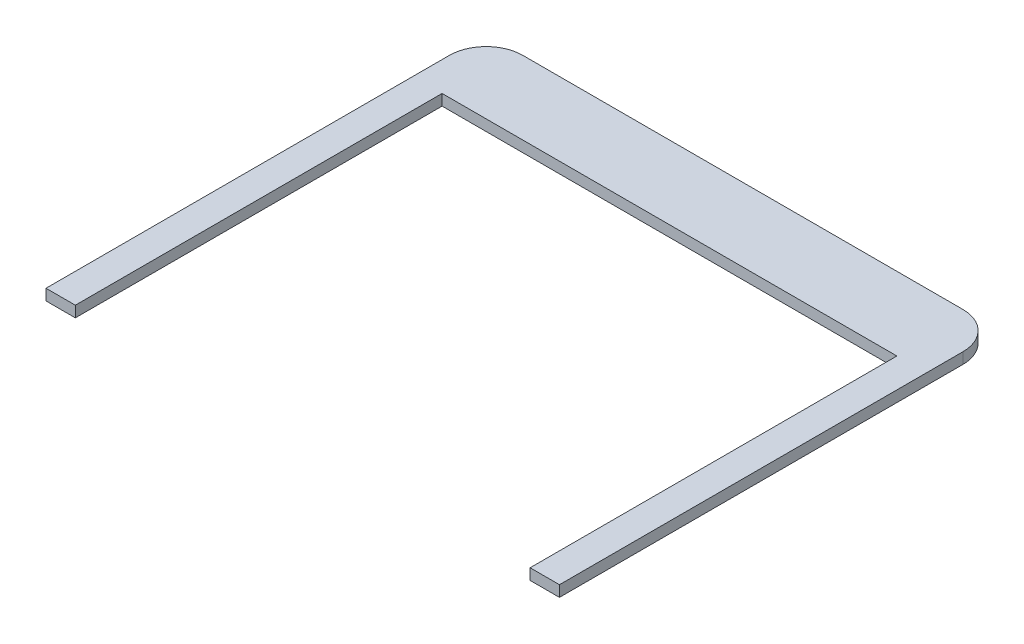
ISO-10303-21;
HEADER;
FILE_DESCRIPTION(('STEP AP214'),'2;1');
FILE_NAME('part.step','',(''),(''),'','','');
FILE_SCHEMA(('AUTOMOTIVE_DESIGN { 1 0 10303 214 1 1 1 1 }'));
ENDSEC;
DATA;
#1=APPLICATION_CONTEXT('core data for automotive mechanical design processes');
#2=APPLICATION_PROTOCOL_DEFINITION('international standard','automotive_design',2000,#1);
#3=PRODUCT_CONTEXT('',#1,'mechanical');
#4=PRODUCT('Part','Part','',(#3));
#5=PRODUCT_RELATED_PRODUCT_CATEGORY('part','',(#4));
#6=PRODUCT_DEFINITION_FORMATION('','',#4);
#7=PRODUCT_DEFINITION_CONTEXT('part definition',#1,'design');
#8=PRODUCT_DEFINITION('design','',#6,#7);
#9=PRODUCT_DEFINITION_SHAPE('','',#8);
#10=(LENGTH_UNIT() NAMED_UNIT(*) SI_UNIT(.MILLI.,.METRE.));
#11=(NAMED_UNIT(*) PLANE_ANGLE_UNIT() SI_UNIT($,.RADIAN.));
#12=(NAMED_UNIT(*) SI_UNIT($,.STERADIAN.) SOLID_ANGLE_UNIT());
#13=UNCERTAINTY_MEASURE_WITH_UNIT(LENGTH_MEASURE(1.E-05),#10,'distance_accuracy_value','');
#14=(GEOMETRIC_REPRESENTATION_CONTEXT(3) GLOBAL_UNCERTAINTY_ASSIGNED_CONTEXT((#13)) GLOBAL_UNIT_ASSIGNED_CONTEXT((#10,
#11,#12)) REPRESENTATION_CONTEXT('',''));
#15=CARTESIAN_POINT('',(0.,0.,0.));
#16=DIRECTION('',(0.,0.,1.));
#17=DIRECTION('',(1.,0.,0.));
#18=AXIS2_PLACEMENT_3D('',#15,#16,#17);
#19=CARTESIAN_POINT('',(69.8787878787879,3.,0.));
#20=DIRECTION('',(-1.,0.,0.));
#21=DIRECTION('',(0.,0.,1.));
#22=AXIS2_PLACEMENT_3D('',#19,#20,#21);
#23=PLANE('',#22);
#24=DIRECTION('',(0.,0.,-1.));
#25=VECTOR('',#24,1.);
#26=CARTESIAN_POINT('',(69.8787878787879,0.,0.));
#27=LINE('',#26,#25);
#28=CARTESIAN_POINT('',(69.8787878787879,0.,85.7575757575757));
#29=VERTEX_POINT('',#28);
#30=CARTESIAN_POINT('',(69.8787878787879,0.,-14.2424242424243));
#31=VERTEX_POINT('',#30);
#32=EDGE_CURVE('E119',#29,#31,#27,.T.);
#33=ORIENTED_EDGE('',*,*,#32,.F.);
#34=DIRECTION('',(0.,-1.,0.));
#35=VECTOR('',#34,1.);
#36=CARTESIAN_POINT('',(69.8787878787879,3.,85.7575757575757));
#37=LINE('',#36,#35);
#38=CARTESIAN_POINT('',(69.8787878787879,3.,85.7575757575757));
#39=VERTEX_POINT('',#38);
#40=EDGE_CURVE('E114',#39,#29,#37,.T.);
#41=ORIENTED_EDGE('',*,*,#40,.F.);
#42=DIRECTION('',(0.,0.,-1.));
#43=VECTOR('',#42,1.);
#44=CARTESIAN_POINT('',(69.8787878787879,3.,0.));
#45=LINE('',#44,#43);
#46=CARTESIAN_POINT('',(69.8787878787879,3.,-14.2424242424243));
#47=VERTEX_POINT('',#46);
#48=EDGE_CURVE('E117',#39,#47,#45,.T.);
#49=ORIENTED_EDGE('',*,*,#48,.T.);
#50=DIRECTION('',(0.,-1.,0.));
#51=VECTOR('',#50,1.);
#52=CARTESIAN_POINT('',(69.8787878787879,3.,-14.2424242424243));
#53=LINE('',#52,#51);
#54=EDGE_CURVE('E153',#47,#31,#53,.T.);
#55=ORIENTED_EDGE('',*,*,#54,.T.);
#56=EDGE_LOOP('',(#33,#41,#49,#55));
#57=FACE_BOUND('',#56,.T.);
#58=ADVANCED_FACE('F35',(#57),#23,.T.);
#59=CARTESIAN_POINT('',(0.,3.,85.7575757575757));
#60=DIRECTION('',(0.,0.,-1.));
#61=DIRECTION('',(-1.,0.,0.));
#62=AXIS2_PLACEMENT_3D('',#59,#60,#61);
#63=PLANE('',#62);
#64=DIRECTION('',(1.,0.,0.));
#65=VECTOR('',#64,1.);
#66=CARTESIAN_POINT('',(0.,0.,85.7575757575757));
#67=LINE('',#66,#65);
#68=CARTESIAN_POINT('',(77.8787878787879,0.,85.7575757575757));
#69=VERTEX_POINT('',#68);
#70=EDGE_CURVE('E155',#29,#69,#67,.T.);
#71=ORIENTED_EDGE('',*,*,#70,.T.);
#72=DIRECTION('',(0.,-1.,0.));
#73=VECTOR('',#72,1.);
#74=CARTESIAN_POINT('',(77.8787878787879,3.,85.7575757575757));
#75=LINE('',#74,#73);
#76=CARTESIAN_POINT('',(77.8787878787879,3.,85.7575757575757));
#77=VERTEX_POINT('',#76);
#78=EDGE_CURVE('E124',#77,#69,#75,.T.);
#79=ORIENTED_EDGE('',*,*,#78,.F.);
#80=DIRECTION('',(1.,0.,0.));
#81=VECTOR('',#80,1.);
#82=CARTESIAN_POINT('',(0.,3.,85.7575757575757));
#83=LINE('',#82,#81);
#84=EDGE_CURVE('E128',#39,#77,#83,.T.);
#85=ORIENTED_EDGE('',*,*,#84,.F.);
#86=ORIENTED_EDGE('',*,*,#40,.T.);
#87=EDGE_LOOP('',(#71,#79,#85,#86));
#88=FACE_BOUND('',#87,.T.);
#89=ADVANCED_FACE('F129',(#88),#63,.F.);
#90=CARTESIAN_POINT('',(77.8787878787879,3.,0.));
#91=DIRECTION('',(1.,0.,0.));
#92=DIRECTION('',(0.,0.,-1.));
#93=AXIS2_PLACEMENT_3D('',#90,#91,#92);
#94=PLANE('',#93);
#95=DIRECTION('',(0.,0.,1.));
#96=VECTOR('',#95,1.);
#97=CARTESIAN_POINT('',(77.8787878787879,0.,0.));
#98=LINE('',#97,#96);
#99=CARTESIAN_POINT('',(77.8787878787879,0.,-24.2424242424243));
#100=VERTEX_POINT('',#99);
#101=EDGE_CURVE('E157',#100,#69,#98,.T.);
#102=ORIENTED_EDGE('',*,*,#101,.F.);
#103=DIRECTION('',(0.,-1.,0.));
#104=VECTOR('',#103,1.);
#105=CARTESIAN_POINT('',(77.8787878787879,3.,-24.2424242424243));
#106=LINE('',#105,#104);
#107=CARTESIAN_POINT('',(77.8787878787879,3.,-24.2424242424243));
#108=VERTEX_POINT('',#107);
#109=EDGE_CURVE('E58',#100,#108,#106,.F.);
#110=ORIENTED_EDGE('',*,*,#109,.T.);
#111=DIRECTION('',(0.,0.,1.));
#112=VECTOR('',#111,1.);
#113=CARTESIAN_POINT('',(77.8787878787879,3.,0.));
#114=LINE('',#113,#112);
#115=EDGE_CURVE('E131',#108,#77,#114,.T.);
#116=ORIENTED_EDGE('',*,*,#115,.T.);
#117=ORIENTED_EDGE('',*,*,#78,.T.);
#118=EDGE_LOOP('',(#102,#110,#116,#117));
#119=FACE_BOUND('',#118,.T.);
#120=ADVANCED_FACE('F196',(#119),#94,.T.);
#121=CARTESIAN_POINT('',(0.,3.,-34.2424242424243));
#122=DIRECTION('',(0.,0.,-1.));
#123=DIRECTION('',(-1.,0.,0.));
#124=AXIS2_PLACEMENT_3D('',#121,#122,#123);
#125=PLANE('',#124);
#126=DIRECTION('',(1.,0.,0.));
#127=VECTOR('',#126,1.);
#128=CARTESIAN_POINT('',(0.,3.,-34.2424242424243));
#129=LINE('',#128,#127);
#130=CARTESIAN_POINT('',(-52.1212121212121,3.,-34.2424242424243));
#131=VERTEX_POINT('',#130);
#132=CARTESIAN_POINT('',(67.8787878787879,3.,-34.2424242424243));
#133=VERTEX_POINT('',#132);
#134=EDGE_CURVE('E145',#131,#133,#129,.T.);
#135=ORIENTED_EDGE('',*,*,#134,.T.);
#136=DIRECTION('',(0.,-1.,0.));
#137=VECTOR('',#136,1.);
#138=CARTESIAN_POINT('',(67.8787878787879,3.,-34.2424242424243));
#139=LINE('',#138,#137);
#140=CARTESIAN_POINT('',(67.8787878787879,0.,-34.2424242424243));
#141=VERTEX_POINT('',#140);
#142=EDGE_CURVE('E178',#133,#141,#139,.T.);
#143=ORIENTED_EDGE('',*,*,#142,.T.);
#144=DIRECTION('',(1.,0.,0.));
#145=VECTOR('',#144,1.);
#146=CARTESIAN_POINT('',(0.,0.,-34.2424242424243));
#147=LINE('',#146,#145);
#148=CARTESIAN_POINT('',(-52.1212121212121,0.,-34.2424242424243));
#149=VERTEX_POINT('',#148);
#150=EDGE_CURVE('E160',#149,#141,#147,.T.);
#151=ORIENTED_EDGE('',*,*,#150,.F.);
#152=DIRECTION('',(0.,-1.,0.));
#153=VECTOR('',#152,1.);
#154=CARTESIAN_POINT('',(-52.1212121212121,3.,-34.2424242424243));
#155=LINE('',#154,#153);
#156=EDGE_CURVE('E123',#149,#131,#155,.F.);
#157=ORIENTED_EDGE('',*,*,#156,.T.);
#158=EDGE_LOOP('',(#135,#143,#151,#157));
#159=FACE_BOUND('',#158,.T.);
#160=ADVANCED_FACE('F190',(#159),#125,.T.);
#161=CARTESIAN_POINT('',(-62.1212121212121,3.,0.));
#162=DIRECTION('',(1.,0.,0.));
#163=DIRECTION('',(0.,0.,-1.));
#164=AXIS2_PLACEMENT_3D('',#161,#162,#163);
#165=PLANE('',#164);
#166=DIRECTION('',(0.,0.,1.));
#167=VECTOR('',#166,1.);
#168=CARTESIAN_POINT('',(-62.1212121212121,3.,0.));
#169=LINE('',#168,#167);
#170=CARTESIAN_POINT('',(-62.1212121212121,3.,-24.2424242424243));
#171=VERTEX_POINT('',#170);
#172=CARTESIAN_POINT('',(-62.1212121212121,3.,85.7575757575757));
#173=VERTEX_POINT('',#172);
#174=EDGE_CURVE('E148',#171,#173,#169,.T.);
#175=ORIENTED_EDGE('',*,*,#174,.F.);
#176=DIRECTION('',(0.,-1.,0.));
#177=VECTOR('',#176,1.);
#178=CARTESIAN_POINT('',(-62.1212121212121,0.,-24.2424242424243));
#179=LINE('',#178,#177);
#180=CARTESIAN_POINT('',(-62.1212121212121,0.,-24.2424242424243));
#181=VERTEX_POINT('',#180);
#182=EDGE_CURVE('E11',#171,#181,#179,.T.);
#183=ORIENTED_EDGE('',*,*,#182,.T.);
#184=DIRECTION('',(0.,0.,1.));
#185=VECTOR('',#184,1.);
#186=CARTESIAN_POINT('',(-62.1212121212121,0.,0.));
#187=LINE('',#186,#185);
#188=CARTESIAN_POINT('',(-62.1212121212121,0.,85.7575757575757));
#189=VERTEX_POINT('',#188);
#190=EDGE_CURVE('E163',#181,#189,#187,.T.);
#191=ORIENTED_EDGE('',*,*,#190,.T.);
#192=DIRECTION('',(0.,-1.,0.));
#193=VECTOR('',#192,1.);
#194=CARTESIAN_POINT('',(-62.1212121212121,3.,85.7575757575757));
#195=LINE('',#194,#193);
#196=EDGE_CURVE('E173',#173,#189,#195,.T.);
#197=ORIENTED_EDGE('',*,*,#196,.F.);
#198=EDGE_LOOP('',(#175,#183,#191,#197));
#199=FACE_BOUND('',#198,.T.);
#200=ADVANCED_FACE('F213',(#199),#165,.F.);
#201=CARTESIAN_POINT('',(-54.1212121212121,0.,85.7575757575757));
#202=VERTEX_POINT('',#201);
#203=EDGE_CURVE('E158',#189,#202,#67,.T.);
#204=ORIENTED_EDGE('',*,*,#203,.T.);
#205=DIRECTION('',(0.,-1.,0.));
#206=VECTOR('',#205,1.);
#207=CARTESIAN_POINT('',(-54.1212121212121,3.,85.7575757575757));
#208=LINE('',#207,#206);
#209=CARTESIAN_POINT('',(-54.1212121212121,3.,85.7575757575757));
#210=VERTEX_POINT('',#209);
#211=EDGE_CURVE('E170',#210,#202,#208,.T.);
#212=ORIENTED_EDGE('',*,*,#211,.F.);
#213=EDGE_CURVE('E133',#173,#210,#83,.T.);
#214=ORIENTED_EDGE('',*,*,#213,.F.);
#215=ORIENTED_EDGE('',*,*,#196,.T.);
#216=EDGE_LOOP('',(#204,#212,#214,#215));
#217=FACE_BOUND('',#216,.T.);
#218=ADVANCED_FACE('F209',(#217),#63,.F.);
#219=CARTESIAN_POINT('',(-54.1212121212121,3.,0.));
#220=DIRECTION('',(-1.,0.,0.));
#221=DIRECTION('',(0.,0.,1.));
#222=AXIS2_PLACEMENT_3D('',#219,#220,#221);
#223=PLANE('',#222);
#224=DIRECTION('',(0.,0.,-1.));
#225=VECTOR('',#224,1.);
#226=CARTESIAN_POINT('',(-54.1212121212121,0.,0.));
#227=LINE('',#226,#225);
#228=CARTESIAN_POINT('',(-54.1212121212121,0.,-14.2424242424243));
#229=VERTEX_POINT('',#228);
#230=EDGE_CURVE('E141',#202,#229,#227,.T.);
#231=ORIENTED_EDGE('',*,*,#230,.T.);
#232=DIRECTION('',(0.,-1.,0.));
#233=VECTOR('',#232,1.);
#234=CARTESIAN_POINT('',(-54.1212121212121,3.,-14.2424242424243));
#235=LINE('',#234,#233);
#236=CARTESIAN_POINT('',(-54.1212121212121,3.,-14.2424242424243));
#237=VERTEX_POINT('',#236);
#238=EDGE_CURVE('E167',#237,#229,#235,.T.);
#239=ORIENTED_EDGE('',*,*,#238,.F.);
#240=DIRECTION('',(0.,0.,-1.));
#241=VECTOR('',#240,1.);
#242=CARTESIAN_POINT('',(-54.1212121212121,3.,0.));
#243=LINE('',#242,#241);
#244=EDGE_CURVE('E150',#210,#237,#243,.T.);
#245=ORIENTED_EDGE('',*,*,#244,.F.);
#246=ORIENTED_EDGE('',*,*,#211,.T.);
#247=EDGE_LOOP('',(#231,#239,#245,#246));
#248=FACE_BOUND('',#247,.T.);
#249=ADVANCED_FACE('F205',(#248),#223,.F.);
#250=CARTESIAN_POINT('',(0.,3.,-14.2424242424243));
#251=DIRECTION('',(0.,0.,-1.));
#252=DIRECTION('',(-1.,0.,0.));
#253=AXIS2_PLACEMENT_3D('',#250,#251,#252);
#254=PLANE('',#253);
#255=DIRECTION('',(1.,0.,0.));
#256=VECTOR('',#255,1.);
#257=CARTESIAN_POINT('',(0.,0.,-14.2424242424243));
#258=LINE('',#257,#256);
#259=EDGE_CURVE('E138',#229,#31,#258,.T.);
#260=ORIENTED_EDGE('',*,*,#259,.T.);
#261=ORIENTED_EDGE('',*,*,#54,.F.);
#262=DIRECTION('',(1.,0.,0.));
#263=VECTOR('',#262,1.);
#264=CARTESIAN_POINT('',(0.,3.,-14.2424242424243));
#265=LINE('',#264,#263);
#266=EDGE_CURVE('E136',#237,#47,#265,.T.);
#267=ORIENTED_EDGE('',*,*,#266,.F.);
#268=ORIENTED_EDGE('',*,*,#238,.T.);
#269=EDGE_LOOP('',(#260,#261,#267,#268));
#270=FACE_BOUND('',#269,.T.);
#271=ADVANCED_FACE('F201',(#270),#254,.F.);
#272=CARTESIAN_POINT('',(0.,3.,0.));
#273=DIRECTION('',(0.,1.,0.));
#274=DIRECTION('',(0.,0.,1.));
#275=AXIS2_PLACEMENT_3D('',#272,#273,#274);
#276=PLANE('',#275);
#277=ORIENTED_EDGE('',*,*,#115,.F.);
#278=CARTESIAN_POINT('',(67.8787878787879,3.,-24.2424242424243));
#279=DIRECTION('',(0.,1.,0.));
#280=DIRECTION('',(0.,0.,1.));
#281=AXIS2_PLACEMENT_3D('',#278,#279,#280);
#282=CIRCLE('',#281,10.);
#283=EDGE_CURVE('E43',#108,#133,#282,.T.);
#284=ORIENTED_EDGE('',*,*,#283,.T.);
#285=ORIENTED_EDGE('',*,*,#134,.F.);
#286=CARTESIAN_POINT('',(-52.1212121212121,3.,-24.2424242424243));
#287=DIRECTION('',(0.,1.,0.));
#288=DIRECTION('',(0.,0.,1.));
#289=AXIS2_PLACEMENT_3D('',#286,#287,#288);
#290=CIRCLE('',#289,10.);
#291=EDGE_CURVE('E50',#131,#171,#290,.T.);
#292=ORIENTED_EDGE('',*,*,#291,.T.);
#293=ORIENTED_EDGE('',*,*,#174,.T.);
#294=ORIENTED_EDGE('',*,*,#213,.T.);
#295=ORIENTED_EDGE('',*,*,#244,.T.);
#296=ORIENTED_EDGE('',*,*,#266,.T.);
#297=ORIENTED_EDGE('',*,*,#48,.F.);
#298=ORIENTED_EDGE('',*,*,#84,.T.);
#299=EDGE_LOOP('',(#277,#284,#285,#292,#293,#294,#295,#296,#297,#298));
#300=FACE_BOUND('',#299,.T.);
#301=ADVANCED_FACE('F134',(#300),#276,.T.);
#302=CARTESIAN_POINT('',(0.,0.,0.));
#303=DIRECTION('',(0.,1.,0.));
#304=DIRECTION('',(0.,0.,1.));
#305=AXIS2_PLACEMENT_3D('',#302,#303,#304);
#306=PLANE('',#305);
#307=ORIENTED_EDGE('',*,*,#150,.T.);
#308=CARTESIAN_POINT('',(67.8787878787879,0.,-24.2424242424243));
#309=DIRECTION('',(0.,1.,0.));
#310=DIRECTION('',(0.,0.,1.));
#311=AXIS2_PLACEMENT_3D('',#308,#309,#310);
#312=CIRCLE('',#311,10.);
#313=EDGE_CURVE('E183',#141,#100,#312,.F.);
#314=ORIENTED_EDGE('',*,*,#313,.T.);
#315=ORIENTED_EDGE('',*,*,#101,.T.);
#316=ORIENTED_EDGE('',*,*,#70,.F.);
#317=ORIENTED_EDGE('',*,*,#32,.T.);
#318=ORIENTED_EDGE('',*,*,#259,.F.);
#319=ORIENTED_EDGE('',*,*,#230,.F.);
#320=ORIENTED_EDGE('',*,*,#203,.F.);
#321=ORIENTED_EDGE('',*,*,#190,.F.);
#322=CARTESIAN_POINT('',(-52.1212121212121,0.,-24.2424242424243));
#323=DIRECTION('',(0.,1.,0.));
#324=DIRECTION('',(0.,0.,1.));
#325=AXIS2_PLACEMENT_3D('',#322,#323,#324);
#326=CIRCLE('',#325,10.);
#327=EDGE_CURVE('E181',#181,#149,#326,.F.);
#328=ORIENTED_EDGE('',*,*,#327,.T.);
#329=EDGE_LOOP('',(#307,#314,#315,#316,#317,#318,#319,#320,#321,#328));
#330=FACE_BOUND('',#329,.T.);
#331=ADVANCED_FACE('F195',(#330),#306,.F.);
#332=CARTESIAN_POINT('',(67.8787878787879,3.,-24.2424242424243));
#333=DIRECTION('',(0.,-1.,0.));
#334=DIRECTION('',(0.,0.,-1.));
#335=AXIS2_PLACEMENT_3D('',#332,#333,#334);
#336=CYLINDRICAL_SURFACE('',#335,10.);
#337=ORIENTED_EDGE('',*,*,#283,.F.);
#338=ORIENTED_EDGE('',*,*,#109,.F.);
#339=ORIENTED_EDGE('',*,*,#313,.F.);
#340=ORIENTED_EDGE('',*,*,#142,.F.);
#341=EDGE_LOOP('',(#337,#338,#339,#340));
#342=FACE_BOUND('',#341,.T.);
#343=ADVANCED_FACE('F193',(#342),#336,.T.);
#344=CARTESIAN_POINT('',(-52.1212121212121,3.,-24.2424242424243));
#345=DIRECTION('',(0.,1.,0.));
#346=DIRECTION('',(0.,0.,1.));
#347=AXIS2_PLACEMENT_3D('',#344,#345,#346);
#348=CYLINDRICAL_SURFACE('',#347,10.);
#349=ORIENTED_EDGE('',*,*,#291,.F.);
#350=ORIENTED_EDGE('',*,*,#156,.F.);
#351=ORIENTED_EDGE('',*,*,#327,.F.);
#352=ORIENTED_EDGE('',*,*,#182,.F.);
#353=EDGE_LOOP('',(#349,#350,#351,#352));
#354=FACE_BOUND('',#353,.T.);
#355=ADVANCED_FACE('F37',(#354),#348,.T.);
#356=CLOSED_SHELL('',(#58,#89,#120,#160,#200,#218,#249,#271,#301,#331,#343,#355));
#357=MANIFOLD_SOLID_BREP('B2',#356);
#358=ADVANCED_BREP_SHAPE_REPRESENTATION('',(#18,#357),#14);
#359=SHAPE_DEFINITION_REPRESENTATION(#9,#358);
ENDSEC;
END-ISO-10303-21;
